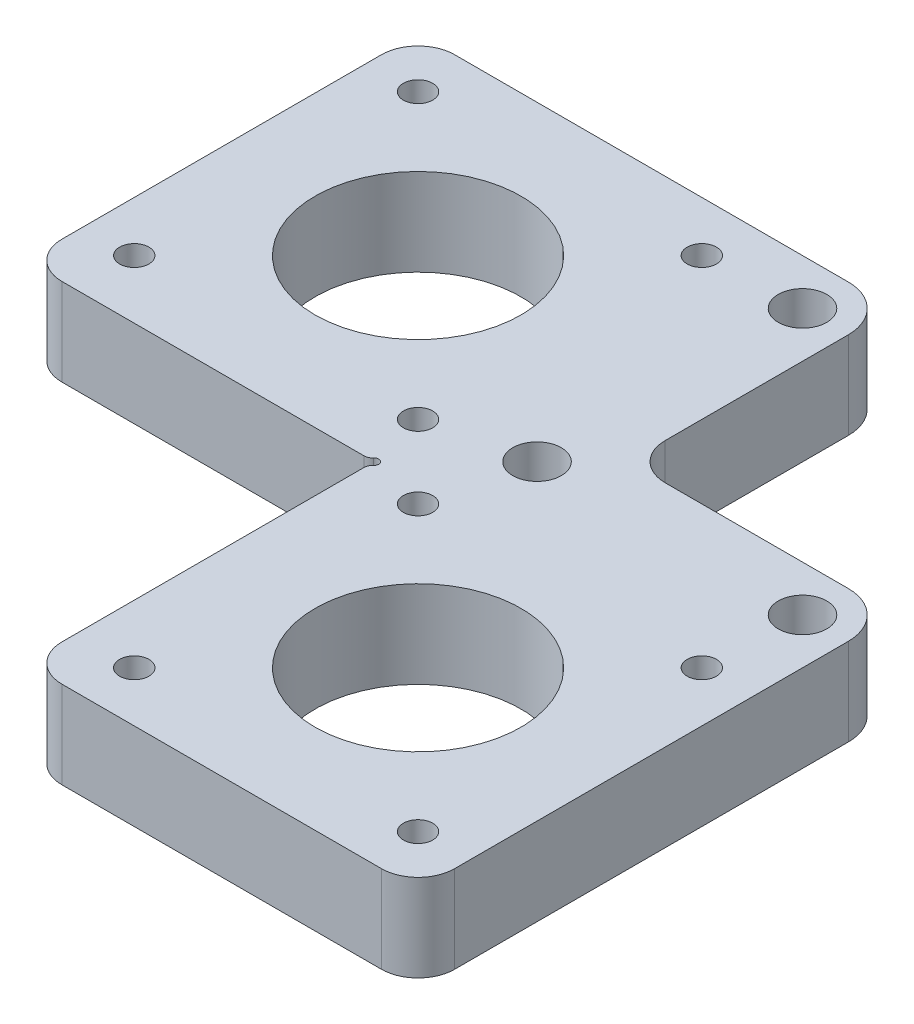
ISO-10303-21;
HEADER;
FILE_DESCRIPTION(('STEP AP214'),'2;1');
FILE_NAME('part.step','',(''),(''),'','','');
FILE_SCHEMA(('AUTOMOTIVE_DESIGN { 1 0 10303 214 1 1 1 1 }'));
ENDSEC;
DATA;
#1=APPLICATION_CONTEXT('core data for automotive mechanical design processes');
#2=APPLICATION_PROTOCOL_DEFINITION('international standard','automotive_design',2000,#1);
#3=PRODUCT_CONTEXT('',#1,'mechanical');
#4=PRODUCT('Part','Part','',(#3));
#5=PRODUCT_RELATED_PRODUCT_CATEGORY('part','',(#4));
#6=PRODUCT_DEFINITION_FORMATION('','',#4);
#7=PRODUCT_DEFINITION_CONTEXT('part definition',#1,'design');
#8=PRODUCT_DEFINITION('design','',#6,#7);
#9=PRODUCT_DEFINITION_SHAPE('','',#8);
#10=(LENGTH_UNIT() NAMED_UNIT(*) SI_UNIT(.MILLI.,.METRE.));
#11=(NAMED_UNIT(*) PLANE_ANGLE_UNIT() SI_UNIT($,.RADIAN.));
#12=(NAMED_UNIT(*) SI_UNIT($,.STERADIAN.) SOLID_ANGLE_UNIT());
#13=UNCERTAINTY_MEASURE_WITH_UNIT(LENGTH_MEASURE(1.E-05),#10,'distance_accuracy_value','');
#14=(GEOMETRIC_REPRESENTATION_CONTEXT(3) GLOBAL_UNCERTAINTY_ASSIGNED_CONTEXT((#13)) GLOBAL_UNIT_ASSIGNED_CONTEXT((#10,
#11,#12)) REPRESENTATION_CONTEXT('',''));
#15=CARTESIAN_POINT('',(0.,0.,0.));
#16=DIRECTION('',(0.,0.,1.));
#17=DIRECTION('',(1.,0.,0.));
#18=AXIS2_PLACEMENT_3D('',#15,#16,#17);
#19=CARTESIAN_POINT('',(0.,9.525,0.));
#20=DIRECTION('',(0.,1.,0.));
#21=DIRECTION('',(0.,0.,1.));
#22=AXIS2_PLACEMENT_3D('',#19,#20,#21);
#23=PLANE('',#22);
#24=DIRECTION('',(1.,0.,0.));
#25=VECTOR('',#24,1.);
#26=CARTESIAN_POINT('',(17.1,9.525,-17.1));
#27=LINE('',#26,#25);
#28=CARTESIAN_POINT('',(-17.,9.525,-17.1));
#29=VERTEX_POINT('',#28);
#30=CARTESIAN_POINT('',(15.9819660112501,9.525,-17.1));
#31=VERTEX_POINT('',#30);
#32=EDGE_CURVE('E281',#29,#31,#27,.T.);
#33=ORIENTED_EDGE('',*,*,#32,.T.);
#34=CARTESIAN_POINT('',(15.9819660112501,9.525,-18.1));
#35=DIRECTION('',(0.,1.,0.));
#36=DIRECTION('',(0.,0.,1.));
#37=AXIS2_PLACEMENT_3D('',#34,#35,#36);
#38=CIRCLE('',#37,1.);
#39=CARTESIAN_POINT('',(16.72732200375,9.525,-17.4333333333333));
#40=VERTEX_POINT('',#39);
#41=EDGE_CURVE('E45',#31,#40,#38,.T.);
#42=ORIENTED_EDGE('',*,*,#41,.T.);
#43=CARTESIAN_POINT('',(17.1,9.525,-17.1));
#44=DIRECTION('',(0.,1.,0.));
#45=DIRECTION('',(0.,0.,1.));
#46=AXIS2_PLACEMENT_3D('',#43,#44,#45);
#47=CIRCLE('',#46,0.499999999999999);
#48=CARTESIAN_POINT('',(17.4333333333333,9.525,-16.72732200375));
#49=VERTEX_POINT('',#48);
#50=EDGE_CURVE('E280',#49,#40,#47,.T.);
#51=ORIENTED_EDGE('',*,*,#50,.F.);
#52=CARTESIAN_POINT('',(18.1,9.525,-15.9819660112501));
#53=DIRECTION('',(0.,1.,0.));
#54=DIRECTION('',(0.,0.,1.));
#55=AXIS2_PLACEMENT_3D('',#52,#53,#54);
#56=CIRCLE('',#55,1.);
#57=CARTESIAN_POINT('',(17.1,9.525,-15.9819660112501));
#58=VERTEX_POINT('',#57);
#59=EDGE_CURVE('E52',#49,#58,#56,.T.);
#60=ORIENTED_EDGE('',*,*,#59,.T.);
#61=DIRECTION('',(0.,0.,1.));
#62=VECTOR('',#61,1.);
#63=CARTESIAN_POINT('',(17.1,9.525,-17.1));
#64=LINE('',#63,#62);
#65=CARTESIAN_POINT('',(17.1,9.525,17.));
#66=VERTEX_POINT('',#65);
#67=EDGE_CURVE('E300',#58,#66,#64,.T.);
#68=ORIENTED_EDGE('',*,*,#67,.T.);
#69=CARTESIAN_POINT('',(21.1,9.525,17.));
#70=DIRECTION('',(0.,1.,0.));
#71=DIRECTION('',(0.,0.,1.));
#72=AXIS2_PLACEMENT_3D('',#69,#70,#71);
#73=CIRCLE('',#72,4.);
#74=CARTESIAN_POINT('',(21.1,9.525,21.));
#75=VERTEX_POINT('',#74);
#76=EDGE_CURVE('E219',#66,#75,#73,.T.);
#77=ORIENTED_EDGE('',*,*,#76,.T.);
#78=DIRECTION('',(1.,0.,0.));
#79=VECTOR('',#78,1.);
#80=CARTESIAN_POINT('',(18.,9.525,21.));
#81=LINE('',#80,#79);
#82=CARTESIAN_POINT('',(56.,9.525,21.));
#83=VERTEX_POINT('',#82);
#84=EDGE_CURVE('E206',#75,#83,#81,.T.);
#85=ORIENTED_EDGE('',*,*,#84,.T.);
#86=CARTESIAN_POINT('',(56.,9.525,17.));
#87=DIRECTION('',(0.,1.,0.));
#88=DIRECTION('',(0.,0.,1.));
#89=AXIS2_PLACEMENT_3D('',#86,#87,#88);
#90=CIRCLE('',#89,4.);
#91=CARTESIAN_POINT('',(60.,9.525,17.));
#92=VERTEX_POINT('',#91);
#93=EDGE_CURVE('E221',#83,#92,#90,.T.);
#94=ORIENTED_EDGE('',*,*,#93,.T.);
#95=DIRECTION('',(0.,0.,-1.));
#96=VECTOR('',#95,1.);
#97=CARTESIAN_POINT('',(60.,9.525,21.));
#98=LINE('',#97,#96);
#99=CARTESIAN_POINT('',(60.,9.525,-26.));
#100=VERTEX_POINT('',#99);
#101=EDGE_CURVE('E183',#92,#100,#98,.T.);
#102=ORIENTED_EDGE('',*,*,#101,.T.);
#103=CARTESIAN_POINT('',(55.,9.525,-26.));
#104=DIRECTION('',(0.,1.,0.));
#105=DIRECTION('',(0.,0.,1.));
#106=AXIS2_PLACEMENT_3D('',#103,#104,#105);
#107=CIRCLE('',#106,5.);
#108=CARTESIAN_POINT('',(55.,9.525,-31.));
#109=VERTEX_POINT('',#108);
#110=EDGE_CURVE('E259',#100,#109,#107,.T.);
#111=ORIENTED_EDGE('',*,*,#110,.T.);
#112=DIRECTION('',(-1.,0.,0.));
#113=VECTOR('',#112,1.);
#114=CARTESIAN_POINT('',(60.,9.525,-31.));
#115=LINE('',#114,#113);
#116=CARTESIAN_POINT('',(35.,9.525,-31.));
#117=VERTEX_POINT('',#116);
#118=EDGE_CURVE('E384',#109,#117,#115,.T.);
#119=ORIENTED_EDGE('',*,*,#118,.T.);
#120=CARTESIAN_POINT('',(35.,9.525,-35.));
#121=DIRECTION('',(0.,1.,0.));
#122=DIRECTION('',(0.,0.,1.));
#123=AXIS2_PLACEMENT_3D('',#120,#121,#122);
#124=CIRCLE('',#123,4.);
#125=CARTESIAN_POINT('',(31.,9.525,-35.));
#126=VERTEX_POINT('',#125);
#127=EDGE_CURVE('E247',#117,#126,#124,.F.);
#128=ORIENTED_EDGE('',*,*,#127,.T.);
#129=DIRECTION('',(0.,0.,-1.));
#130=VECTOR('',#129,1.);
#131=CARTESIAN_POINT('',(31.,9.525,-31.));
#132=LINE('',#131,#130);
#133=CARTESIAN_POINT('',(31.,9.525,-55.));
#134=VERTEX_POINT('',#133);
#135=EDGE_CURVE('E386',#126,#134,#132,.T.);
#136=ORIENTED_EDGE('',*,*,#135,.T.);
#137=CARTESIAN_POINT('',(26.,9.525,-55.));
#138=DIRECTION('',(0.,1.,0.));
#139=DIRECTION('',(0.,0.,1.));
#140=AXIS2_PLACEMENT_3D('',#137,#138,#139);
#141=CIRCLE('',#140,5.);
#142=CARTESIAN_POINT('',(26.,9.525,-60.));
#143=VERTEX_POINT('',#142);
#144=EDGE_CURVE('E257',#134,#143,#141,.T.);
#145=ORIENTED_EDGE('',*,*,#144,.T.);
#146=DIRECTION('',(-1.,0.,0.));
#147=VECTOR('',#146,1.);
#148=CARTESIAN_POINT('',(31.,9.525,-60.));
#149=LINE('',#148,#147);
#150=CARTESIAN_POINT('',(-17.,9.525,-60.));
#151=VERTEX_POINT('',#150);
#152=EDGE_CURVE('E389',#143,#151,#149,.T.);
#153=ORIENTED_EDGE('',*,*,#152,.T.);
#154=CARTESIAN_POINT('',(-17.,9.525,-56.));
#155=DIRECTION('',(0.,1.,0.));
#156=DIRECTION('',(0.,0.,1.));
#157=AXIS2_PLACEMENT_3D('',#154,#155,#156);
#158=CIRCLE('',#157,4.);
#159=CARTESIAN_POINT('',(-21.,9.525,-56.));
#160=VERTEX_POINT('',#159);
#161=EDGE_CURVE('E215',#151,#160,#158,.T.);
#162=ORIENTED_EDGE('',*,*,#161,.T.);
#163=DIRECTION('',(0.,0.,1.));
#164=VECTOR('',#163,1.);
#165=CARTESIAN_POINT('',(-21.,9.525,-60.));
#166=LINE('',#165,#164);
#167=CARTESIAN_POINT('',(-21.,9.525,-21.1));
#168=VERTEX_POINT('',#167);
#169=EDGE_CURVE('E185',#160,#168,#166,.T.);
#170=ORIENTED_EDGE('',*,*,#169,.T.);
#171=CARTESIAN_POINT('',(-17.,9.525,-21.1));
#172=DIRECTION('',(0.,1.,0.));
#173=DIRECTION('',(0.,0.,1.));
#174=AXIS2_PLACEMENT_3D('',#171,#172,#173);
#175=CIRCLE('',#174,4.);
#176=EDGE_CURVE('E217',#168,#29,#175,.T.);
#177=ORIENTED_EDGE('',*,*,#176,.T.);
#178=EDGE_LOOP('',(#33,#42,#51,#60,#68,#77,#85,#94,#102,#111,#119,#128,#136,#145,#153,#162,#170,#177));
#179=FACE_BOUND('',#178,.T.);
#180=CARTESIAN_POINT('',(26.,9.525,-55.));
#181=DIRECTION('',(0.,1.,0.));
#182=DIRECTION('',(0.,0.,1.));
#183=AXIS2_PLACEMENT_3D('',#180,#181,#182);
#184=CIRCLE('',#183,2.65);
#185=CARTESIAN_POINT('',(26.,9.525,-52.35));
#186=VERTEX_POINT('',#185);
#187=EDGE_CURVE('E298',#186,#186,#184,.T.);
#188=ORIENTED_EDGE('',*,*,#187,.F.);
#189=EDGE_LOOP('',(#188));
#190=FACE_BOUND('',#189,.T.);
#191=CARTESIAN_POINT('',(26.,9.525,-26.));
#192=DIRECTION('',(0.,1.,0.));
#193=DIRECTION('',(0.,0.,1.));
#194=AXIS2_PLACEMENT_3D('',#191,#192,#193);
#195=CIRCLE('',#194,2.65);
#196=CARTESIAN_POINT('',(26.,9.525,-23.35));
#197=VERTEX_POINT('',#196);
#198=EDGE_CURVE('E310',#197,#197,#195,.T.);
#199=ORIENTED_EDGE('',*,*,#198,.F.);
#200=EDGE_LOOP('',(#199));
#201=FACE_BOUND('',#200,.T.);
#202=CARTESIAN_POINT('',(55.,9.525,-26.));
#203=DIRECTION('',(0.,1.,0.));
#204=DIRECTION('',(0.,0.,1.));
#205=AXIS2_PLACEMENT_3D('',#202,#203,#204);
#206=CIRCLE('',#205,2.65);
#207=CARTESIAN_POINT('',(55.,9.525,-23.35));
#208=VERTEX_POINT('',#207);
#209=EDGE_CURVE('E316',#208,#208,#206,.T.);
#210=ORIENTED_EDGE('',*,*,#209,.F.);
#211=EDGE_LOOP('',(#210));
#212=FACE_BOUND('',#211,.T.);
#213=CARTESIAN_POINT('',(54.5,9.525,-15.5));
#214=DIRECTION('',(0.,-1.,0.));
#215=DIRECTION('',(0.,0.,-1.));
#216=AXIS2_PLACEMENT_3D('',#213,#214,#215);
#217=CIRCLE('',#216,1.6);
#218=CARTESIAN_POINT('',(54.5,9.525,-17.1));
#219=VERTEX_POINT('',#218);
#220=EDGE_CURVE('E325',#219,#219,#217,.T.);
#221=ORIENTED_EDGE('',*,*,#220,.T.);
#222=EDGE_LOOP('',(#221));
#223=FACE_BOUND('',#222,.T.);
#224=CARTESIAN_POINT('',(23.5,9.525,-15.5));
#225=DIRECTION('',(0.,-1.,0.));
#226=DIRECTION('',(0.,0.,-1.));
#227=AXIS2_PLACEMENT_3D('',#224,#225,#226);
#228=CIRCLE('',#227,1.6);
#229=CARTESIAN_POINT('',(23.5,9.525,-17.1));
#230=VERTEX_POINT('',#229);
#231=EDGE_CURVE('E331',#230,#230,#228,.T.);
#232=ORIENTED_EDGE('',*,*,#231,.T.);
#233=EDGE_LOOP('',(#232));
#234=FACE_BOUND('',#233,.T.);
#235=CARTESIAN_POINT('',(23.5,9.525,15.5));
#236=DIRECTION('',(0.,-1.,0.));
#237=DIRECTION('',(0.,0.,-1.));
#238=AXIS2_PLACEMENT_3D('',#235,#236,#237);
#239=CIRCLE('',#238,1.6);
#240=CARTESIAN_POINT('',(23.5,9.525,13.9));
#241=VERTEX_POINT('',#240);
#242=EDGE_CURVE('E337',#241,#241,#239,.T.);
#243=ORIENTED_EDGE('',*,*,#242,.T.);
#244=EDGE_LOOP('',(#243));
#245=FACE_BOUND('',#244,.T.);
#246=CARTESIAN_POINT('',(54.5,9.525,15.5));
#247=DIRECTION('',(0.,-1.,0.));
#248=DIRECTION('',(0.,0.,-1.));
#249=AXIS2_PLACEMENT_3D('',#246,#247,#248);
#250=CIRCLE('',#249,1.6);
#251=CARTESIAN_POINT('',(54.5,9.525,13.9));
#252=VERTEX_POINT('',#251);
#253=EDGE_CURVE('E343',#252,#252,#250,.T.);
#254=ORIENTED_EDGE('',*,*,#253,.T.);
#255=EDGE_LOOP('',(#254));
#256=FACE_BOUND('',#255,.T.);
#257=CARTESIAN_POINT('',(15.5,9.525,-54.5));
#258=DIRECTION('',(0.,-1.,0.));
#259=DIRECTION('',(0.,0.,-1.));
#260=AXIS2_PLACEMENT_3D('',#257,#258,#259);
#261=CIRCLE('',#260,1.6);
#262=CARTESIAN_POINT('',(15.5,9.525,-56.1));
#263=VERTEX_POINT('',#262);
#264=EDGE_CURVE('E349',#263,#263,#261,.T.);
#265=ORIENTED_EDGE('',*,*,#264,.T.);
#266=EDGE_LOOP('',(#265));
#267=FACE_BOUND('',#266,.T.);
#268=CARTESIAN_POINT('',(15.5,9.525,-23.5));
#269=DIRECTION('',(0.,-1.,0.));
#270=DIRECTION('',(0.,0.,-1.));
#271=AXIS2_PLACEMENT_3D('',#268,#269,#270);
#272=CIRCLE('',#271,1.6);
#273=CARTESIAN_POINT('',(15.5,9.525,-25.1));
#274=VERTEX_POINT('',#273);
#275=EDGE_CURVE('E355',#274,#274,#272,.T.);
#276=ORIENTED_EDGE('',*,*,#275,.T.);
#277=EDGE_LOOP('',(#276));
#278=FACE_BOUND('',#277,.T.);
#279=CARTESIAN_POINT('',(-15.5,9.525,-23.5));
#280=DIRECTION('',(0.,-1.,0.));
#281=DIRECTION('',(0.,0.,-1.));
#282=AXIS2_PLACEMENT_3D('',#279,#280,#281);
#283=CIRCLE('',#282,1.6);
#284=CARTESIAN_POINT('',(-15.5,9.525,-25.1));
#285=VERTEX_POINT('',#284);
#286=EDGE_CURVE('E361',#285,#285,#283,.T.);
#287=ORIENTED_EDGE('',*,*,#286,.T.);
#288=EDGE_LOOP('',(#287));
#289=FACE_BOUND('',#288,.T.);
#290=CARTESIAN_POINT('',(39.,9.525,0.));
#291=DIRECTION('',(0.,1.,0.));
#292=DIRECTION('',(0.,0.,1.));
#293=AXIS2_PLACEMENT_3D('',#290,#291,#292);
#294=CIRCLE('',#293,11.25);
#295=CARTESIAN_POINT('',(39.,9.525,11.25));
#296=VERTEX_POINT('',#295);
#297=EDGE_CURVE('E376',#296,#296,#294,.T.);
#298=ORIENTED_EDGE('',*,*,#297,.F.);
#299=EDGE_LOOP('',(#298));
#300=FACE_BOUND('',#299,.T.);
#301=CARTESIAN_POINT('',(0.,9.525,-39.));
#302=DIRECTION('',(0.,1.,0.));
#303=DIRECTION('',(0.,0.,1.));
#304=AXIS2_PLACEMENT_3D('',#301,#302,#303);
#305=CIRCLE('',#304,11.25);
#306=CARTESIAN_POINT('',(0.,9.525,-27.75));
#307=VERTEX_POINT('',#306);
#308=EDGE_CURVE('E370',#307,#307,#305,.T.);
#309=ORIENTED_EDGE('',*,*,#308,.F.);
#310=EDGE_LOOP('',(#309));
#311=FACE_BOUND('',#310,.T.);
#312=CARTESIAN_POINT('',(-15.5,9.525,-54.5));
#313=DIRECTION('',(0.,-1.,0.));
#314=DIRECTION('',(0.,0.,-1.));
#315=AXIS2_PLACEMENT_3D('',#312,#313,#314);
#316=CIRCLE('',#315,1.6);
#317=CARTESIAN_POINT('',(-15.5,9.525,-56.1));
#318=VERTEX_POINT('',#317);
#319=EDGE_CURVE('E367',#318,#318,#316,.T.);
#320=ORIENTED_EDGE('',*,*,#319,.T.);
#321=EDGE_LOOP('',(#320));
#322=FACE_BOUND('',#321,.T.);
#323=ADVANCED_FACE('F37',(#179,#190,#201,#212,#223,#234,#245,#256,#267,#278,#289,#300,#311,
#322),#23,.T.);
#324=CARTESIAN_POINT('',(18.,9.525,21.));
#325=DIRECTION('',(0.,0.,-1.));
#326=DIRECTION('',(-1.,0.,0.));
#327=AXIS2_PLACEMENT_3D('',#324,#325,#326);
#328=PLANE('',#327);
#329=DIRECTION('',(1.,0.,0.));
#330=VECTOR('',#329,1.);
#331=CARTESIAN_POINT('',(18.,0.,21.));
#332=LINE('',#331,#330);
#333=CARTESIAN_POINT('',(21.1,0.,21.));
#334=VERTEX_POINT('',#333);
#335=CARTESIAN_POINT('',(56.,0.,21.));
#336=VERTEX_POINT('',#335);
#337=EDGE_CURVE('E192',#334,#336,#332,.T.);
#338=ORIENTED_EDGE('',*,*,#337,.T.);
#339=DIRECTION('',(0.,-1.,0.));
#340=VECTOR('',#339,1.);
#341=CARTESIAN_POINT('',(56.,9.525,21.));
#342=LINE('',#341,#340);
#343=EDGE_CURVE('E168',#336,#83,#342,.F.);
#344=ORIENTED_EDGE('',*,*,#343,.T.);
#345=ORIENTED_EDGE('',*,*,#84,.F.);
#346=DIRECTION('',(0.,1.,0.));
#347=VECTOR('',#346,1.);
#348=CARTESIAN_POINT('',(21.1,0.,21.));
#349=LINE('',#348,#347);
#350=EDGE_CURVE('E173',#75,#334,#349,.F.);
#351=ORIENTED_EDGE('',*,*,#350,.T.);
#352=EDGE_LOOP('',(#338,#344,#345,#351));
#353=FACE_BOUND('',#352,.T.);
#354=ADVANCED_FACE('F416',(#353),#328,.F.);
#355=CARTESIAN_POINT('',(60.,9.525,21.));
#356=DIRECTION('',(-1.,0.,0.));
#357=DIRECTION('',(0.,0.,1.));
#358=AXIS2_PLACEMENT_3D('',#355,#356,#357);
#359=PLANE('',#358);
#360=DIRECTION('',(0.,0.,-1.));
#361=VECTOR('',#360,1.);
#362=CARTESIAN_POINT('',(60.,0.,21.));
#363=LINE('',#362,#361);
#364=CARTESIAN_POINT('',(60.,0.,17.));
#365=VERTEX_POINT('',#364);
#366=CARTESIAN_POINT('',(60.,0.,-26.));
#367=VERTEX_POINT('',#366);
#368=EDGE_CURVE('E180',#365,#367,#363,.T.);
#369=ORIENTED_EDGE('',*,*,#368,.T.);
#370=DIRECTION('',(0.,-1.,0.));
#371=VECTOR('',#370,1.);
#372=CARTESIAN_POINT('',(60.,9.525,-26.));
#373=LINE('',#372,#371);
#374=EDGE_CURVE('E255',#367,#100,#373,.F.);
#375=ORIENTED_EDGE('',*,*,#374,.T.);
#376=ORIENTED_EDGE('',*,*,#101,.F.);
#377=DIRECTION('',(0.,-1.,0.));
#378=VECTOR('',#377,1.);
#379=CARTESIAN_POINT('',(60.,9.525,17.));
#380=LINE('',#379,#378);
#381=EDGE_CURVE('E167',#92,#365,#380,.T.);
#382=ORIENTED_EDGE('',*,*,#381,.T.);
#383=EDGE_LOOP('',(#369,#375,#376,#382));
#384=FACE_BOUND('',#383,.T.);
#385=ADVANCED_FACE('F179',(#384),#359,.F.);
#386=CARTESIAN_POINT('',(60.,9.525,-31.));
#387=DIRECTION('',(0.,0.,1.));
#388=DIRECTION('',(1.,0.,0.));
#389=AXIS2_PLACEMENT_3D('',#386,#387,#388);
#390=PLANE('',#389);
#391=ORIENTED_EDGE('',*,*,#118,.F.);
#392=DIRECTION('',(0.,-1.,0.));
#393=VECTOR('',#392,1.);
#394=CARTESIAN_POINT('',(55.,9.525,-31.));
#395=LINE('',#394,#393);
#396=CARTESIAN_POINT('',(55.,0.,-31.));
#397=VERTEX_POINT('',#396);
#398=EDGE_CURVE('E249',#109,#397,#395,.T.);
#399=ORIENTED_EDGE('',*,*,#398,.T.);
#400=DIRECTION('',(-1.,0.,0.));
#401=VECTOR('',#400,1.);
#402=CARTESIAN_POINT('',(60.,0.,-31.));
#403=LINE('',#402,#401);
#404=CARTESIAN_POINT('',(35.,0.,-31.));
#405=VERTEX_POINT('',#404);
#406=EDGE_CURVE('E191',#397,#405,#403,.T.);
#407=ORIENTED_EDGE('',*,*,#406,.T.);
#408=DIRECTION('',(0.,-1.,0.));
#409=VECTOR('',#408,1.);
#410=CARTESIAN_POINT('',(35.,9.525,-31.));
#411=LINE('',#410,#409);
#412=EDGE_CURVE('E241',#405,#117,#411,.F.);
#413=ORIENTED_EDGE('',*,*,#412,.T.);
#414=EDGE_LOOP('',(#391,#399,#407,#413));
#415=FACE_BOUND('',#414,.T.);
#416=ADVANCED_FACE('F439',(#415),#390,.F.);
#417=CARTESIAN_POINT('',(31.,9.525,-31.));
#418=DIRECTION('',(-1.,0.,0.));
#419=DIRECTION('',(0.,0.,1.));
#420=AXIS2_PLACEMENT_3D('',#417,#418,#419);
#421=PLANE('',#420);
#422=DIRECTION('',(0.,0.,-1.));
#423=VECTOR('',#422,1.);
#424=CARTESIAN_POINT('',(31.,0.,-31.));
#425=LINE('',#424,#423);
#426=CARTESIAN_POINT('',(31.,0.,-35.));
#427=VERTEX_POINT('',#426);
#428=CARTESIAN_POINT('',(31.,0.,-55.));
#429=VERTEX_POINT('',#428);
#430=EDGE_CURVE('E194',#427,#429,#425,.T.);
#431=ORIENTED_EDGE('',*,*,#430,.T.);
#432=DIRECTION('',(0.,-1.,0.));
#433=VECTOR('',#432,1.);
#434=CARTESIAN_POINT('',(31.,9.525,-55.));
#435=LINE('',#434,#433);
#436=EDGE_CURVE('E264',#429,#134,#435,.F.);
#437=ORIENTED_EDGE('',*,*,#436,.T.);
#438=ORIENTED_EDGE('',*,*,#135,.F.);
#439=DIRECTION('',(0.,-1.,0.));
#440=VECTOR('',#439,1.);
#441=CARTESIAN_POINT('',(31.,0.,-35.));
#442=LINE('',#441,#440);
#443=EDGE_CURVE('E238',#126,#427,#442,.T.);
#444=ORIENTED_EDGE('',*,*,#443,.T.);
#445=EDGE_LOOP('',(#431,#437,#438,#444));
#446=FACE_BOUND('',#445,.T.);
#447=ADVANCED_FACE('F435',(#446),#421,.F.);
#448=CARTESIAN_POINT('',(31.,9.525,-60.));
#449=DIRECTION('',(0.,0.,1.));
#450=DIRECTION('',(1.,0.,0.));
#451=AXIS2_PLACEMENT_3D('',#448,#449,#450);
#452=PLANE('',#451);
#453=ORIENTED_EDGE('',*,*,#152,.F.);
#454=DIRECTION('',(0.,-1.,0.));
#455=VECTOR('',#454,1.);
#456=CARTESIAN_POINT('',(26.,9.525,-60.));
#457=LINE('',#456,#455);
#458=CARTESIAN_POINT('',(26.,0.,-60.));
#459=VERTEX_POINT('',#458);
#460=EDGE_CURVE('E261',#143,#459,#457,.T.);
#461=ORIENTED_EDGE('',*,*,#460,.T.);
#462=DIRECTION('',(-1.,0.,0.));
#463=VECTOR('',#462,1.);
#464=CARTESIAN_POINT('',(31.,0.,-60.));
#465=LINE('',#464,#463);
#466=CARTESIAN_POINT('',(-17.,0.,-60.));
#467=VERTEX_POINT('',#466);
#468=EDGE_CURVE('E202',#459,#467,#465,.T.);
#469=ORIENTED_EDGE('',*,*,#468,.T.);
#470=DIRECTION('',(0.,-1.,0.));
#471=VECTOR('',#470,1.);
#472=CARTESIAN_POINT('',(-17.,9.525,-60.));
#473=LINE('',#472,#471);
#474=EDGE_CURVE('E235',#467,#151,#473,.F.);
#475=ORIENTED_EDGE('',*,*,#474,.T.);
#476=EDGE_LOOP('',(#453,#461,#469,#475));
#477=FACE_BOUND('',#476,.T.);
#478=ADVANCED_FACE('F432',(#477),#452,.F.);
#479=CARTESIAN_POINT('',(-21.,9.525,-60.));
#480=DIRECTION('',(1.,0.,0.));
#481=DIRECTION('',(0.,0.,-1.));
#482=AXIS2_PLACEMENT_3D('',#479,#480,#481);
#483=PLANE('',#482);
#484=DIRECTION('',(0.,0.,1.));
#485=VECTOR('',#484,1.);
#486=CARTESIAN_POINT('',(-21.,0.,-60.));
#487=LINE('',#486,#485);
#488=CARTESIAN_POINT('',(-21.,0.,-56.));
#489=VERTEX_POINT('',#488);
#490=CARTESIAN_POINT('',(-21.,0.,-21.1));
#491=VERTEX_POINT('',#490);
#492=EDGE_CURVE('E204',#489,#491,#487,.T.);
#493=ORIENTED_EDGE('',*,*,#492,.T.);
#494=DIRECTION('',(0.,1.,0.));
#495=VECTOR('',#494,1.);
#496=CARTESIAN_POINT('',(-21.,9.525,-21.1));
#497=LINE('',#496,#495);
#498=EDGE_CURVE('E229',#491,#168,#497,.T.);
#499=ORIENTED_EDGE('',*,*,#498,.T.);
#500=ORIENTED_EDGE('',*,*,#169,.F.);
#501=DIRECTION('',(0.,-1.,0.));
#502=VECTOR('',#501,1.);
#503=CARTESIAN_POINT('',(-21.,9.525,-56.));
#504=LINE('',#503,#502);
#505=EDGE_CURVE('E226',#160,#489,#504,.T.);
#506=ORIENTED_EDGE('',*,*,#505,.T.);
#507=EDGE_LOOP('',(#493,#499,#500,#506));
#508=FACE_BOUND('',#507,.T.);
#509=ADVANCED_FACE('F395',(#508),#483,.F.);
#510=CARTESIAN_POINT('',(0.,0.,0.));
#511=DIRECTION('',(0.,1.,0.));
#512=DIRECTION('',(0.,0.,1.));
#513=AXIS2_PLACEMENT_3D('',#510,#511,#512);
#514=PLANE('',#513);
#515=CARTESIAN_POINT('',(26.,0.,-55.));
#516=DIRECTION('',(0.,1.,0.));
#517=DIRECTION('',(0.,0.,1.));
#518=AXIS2_PLACEMENT_3D('',#515,#516,#517);
#519=CIRCLE('',#518,2.65);
#520=CARTESIAN_POINT('',(26.,0.,-52.35));
#521=VERTEX_POINT('',#520);
#522=EDGE_CURVE('E307',#521,#521,#519,.T.);
#523=ORIENTED_EDGE('',*,*,#522,.T.);
#524=EDGE_LOOP('',(#523));
#525=FACE_BOUND('',#524,.T.);
#526=CARTESIAN_POINT('',(26.,0.,-26.));
#527=DIRECTION('',(0.,1.,0.));
#528=DIRECTION('',(0.,0.,1.));
#529=AXIS2_PLACEMENT_3D('',#526,#527,#528);
#530=CIRCLE('',#529,2.65);
#531=CARTESIAN_POINT('',(26.,0.,-23.35));
#532=VERTEX_POINT('',#531);
#533=EDGE_CURVE('E313',#532,#532,#530,.T.);
#534=ORIENTED_EDGE('',*,*,#533,.T.);
#535=EDGE_LOOP('',(#534));
#536=FACE_BOUND('',#535,.T.);
#537=CARTESIAN_POINT('',(55.,0.,-26.));
#538=DIRECTION('',(0.,1.,0.));
#539=DIRECTION('',(0.,0.,1.));
#540=AXIS2_PLACEMENT_3D('',#537,#538,#539);
#541=CIRCLE('',#540,2.65);
#542=CARTESIAN_POINT('',(55.,0.,-23.35));
#543=VERTEX_POINT('',#542);
#544=EDGE_CURVE('E319',#543,#543,#541,.T.);
#545=ORIENTED_EDGE('',*,*,#544,.T.);
#546=EDGE_LOOP('',(#545));
#547=FACE_BOUND('',#546,.T.);
#548=CARTESIAN_POINT('',(54.5,0.,-15.5));
#549=DIRECTION('',(0.,-1.,0.));
#550=DIRECTION('',(0.,0.,-1.));
#551=AXIS2_PLACEMENT_3D('',#548,#549,#550);
#552=CIRCLE('',#551,1.6);
#553=CARTESIAN_POINT('',(54.5,0.,-17.1));
#554=VERTEX_POINT('',#553);
#555=EDGE_CURVE('E322',#554,#554,#552,.T.);
#556=ORIENTED_EDGE('',*,*,#555,.F.);
#557=EDGE_LOOP('',(#556));
#558=FACE_BOUND('',#557,.T.);
#559=CARTESIAN_POINT('',(23.5,0.,-15.5));
#560=DIRECTION('',(0.,-1.,0.));
#561=DIRECTION('',(0.,0.,-1.));
#562=AXIS2_PLACEMENT_3D('',#559,#560,#561);
#563=CIRCLE('',#562,1.6);
#564=CARTESIAN_POINT('',(23.5,0.,-17.1));
#565=VERTEX_POINT('',#564);
#566=EDGE_CURVE('E328',#565,#565,#563,.T.);
#567=ORIENTED_EDGE('',*,*,#566,.F.);
#568=EDGE_LOOP('',(#567));
#569=FACE_BOUND('',#568,.T.);
#570=CARTESIAN_POINT('',(23.5,0.,15.5));
#571=DIRECTION('',(0.,-1.,0.));
#572=DIRECTION('',(0.,0.,-1.));
#573=AXIS2_PLACEMENT_3D('',#570,#571,#572);
#574=CIRCLE('',#573,1.6);
#575=CARTESIAN_POINT('',(23.5,0.,13.9));
#576=VERTEX_POINT('',#575);
#577=EDGE_CURVE('E334',#576,#576,#574,.T.);
#578=ORIENTED_EDGE('',*,*,#577,.F.);
#579=EDGE_LOOP('',(#578));
#580=FACE_BOUND('',#579,.T.);
#581=CARTESIAN_POINT('',(54.5,0.,15.5));
#582=DIRECTION('',(0.,-1.,0.));
#583=DIRECTION('',(0.,0.,-1.));
#584=AXIS2_PLACEMENT_3D('',#581,#582,#583);
#585=CIRCLE('',#584,1.6);
#586=CARTESIAN_POINT('',(54.5,0.,13.9));
#587=VERTEX_POINT('',#586);
#588=EDGE_CURVE('E340',#587,#587,#585,.T.);
#589=ORIENTED_EDGE('',*,*,#588,.F.);
#590=EDGE_LOOP('',(#589));
#591=FACE_BOUND('',#590,.T.);
#592=CARTESIAN_POINT('',(15.5,0.,-54.5));
#593=DIRECTION('',(0.,-1.,0.));
#594=DIRECTION('',(0.,0.,-1.));
#595=AXIS2_PLACEMENT_3D('',#592,#593,#594);
#596=CIRCLE('',#595,1.6);
#597=CARTESIAN_POINT('',(15.5,0.,-56.1));
#598=VERTEX_POINT('',#597);
#599=EDGE_CURVE('E346',#598,#598,#596,.T.);
#600=ORIENTED_EDGE('',*,*,#599,.F.);
#601=EDGE_LOOP('',(#600));
#602=FACE_BOUND('',#601,.T.);
#603=CARTESIAN_POINT('',(15.5,0.,-23.5));
#604=DIRECTION('',(0.,-1.,0.));
#605=DIRECTION('',(0.,0.,-1.));
#606=AXIS2_PLACEMENT_3D('',#603,#604,#605);
#607=CIRCLE('',#606,1.6);
#608=CARTESIAN_POINT('',(15.5,0.,-25.1));
#609=VERTEX_POINT('',#608);
#610=EDGE_CURVE('E352',#609,#609,#607,.T.);
#611=ORIENTED_EDGE('',*,*,#610,.F.);
#612=EDGE_LOOP('',(#611));
#613=FACE_BOUND('',#612,.T.);
#614=CARTESIAN_POINT('',(-15.5,0.,-23.5));
#615=DIRECTION('',(0.,-1.,0.));
#616=DIRECTION('',(0.,0.,-1.));
#617=AXIS2_PLACEMENT_3D('',#614,#615,#616);
#618=CIRCLE('',#617,1.6);
#619=CARTESIAN_POINT('',(-15.5,0.,-25.1));
#620=VERTEX_POINT('',#619);
#621=EDGE_CURVE('E358',#620,#620,#618,.T.);
#622=ORIENTED_EDGE('',*,*,#621,.F.);
#623=EDGE_LOOP('',(#622));
#624=FACE_BOUND('',#623,.T.);
#625=CARTESIAN_POINT('',(-15.5,0.,-54.5));
#626=DIRECTION('',(0.,-1.,0.));
#627=DIRECTION('',(0.,0.,-1.));
#628=AXIS2_PLACEMENT_3D('',#625,#626,#627);
#629=CIRCLE('',#628,1.6);
#630=CARTESIAN_POINT('',(-15.5,0.,-56.1));
#631=VERTEX_POINT('',#630);
#632=EDGE_CURVE('E364',#631,#631,#629,.T.);
#633=ORIENTED_EDGE('',*,*,#632,.F.);
#634=EDGE_LOOP('',(#633));
#635=FACE_BOUND('',#634,.T.);
#636=CARTESIAN_POINT('',(0.,0.,-39.));
#637=DIRECTION('',(0.,1.,0.));
#638=DIRECTION('',(0.,0.,1.));
#639=AXIS2_PLACEMENT_3D('',#636,#637,#638);
#640=CIRCLE('',#639,11.25);
#641=CARTESIAN_POINT('',(0.,0.,-27.75));
#642=VERTEX_POINT('',#641);
#643=EDGE_CURVE('E373',#642,#642,#640,.T.);
#644=ORIENTED_EDGE('',*,*,#643,.T.);
#645=EDGE_LOOP('',(#644));
#646=FACE_BOUND('',#645,.T.);
#647=CARTESIAN_POINT('',(39.,0.,0.));
#648=DIRECTION('',(0.,1.,0.));
#649=DIRECTION('',(0.,0.,1.));
#650=AXIS2_PLACEMENT_3D('',#647,#648,#649);
#651=CIRCLE('',#650,11.25);
#652=CARTESIAN_POINT('',(39.,0.,11.25));
#653=VERTEX_POINT('',#652);
#654=EDGE_CURVE('E196',#653,#653,#651,.T.);
#655=ORIENTED_EDGE('',*,*,#654,.T.);
#656=EDGE_LOOP('',(#655));
#657=FACE_BOUND('',#656,.T.);
#658=CARTESIAN_POINT('',(17.1,0.,-17.1));
#659=DIRECTION('',(0.,1.,0.));
#660=DIRECTION('',(0.,0.,1.));
#661=AXIS2_PLACEMENT_3D('',#658,#659,#660);
#662=CIRCLE('',#661,0.499999999999999);
#663=CARTESIAN_POINT('',(16.72732200375,0.,-17.4333333333333));
#664=VERTEX_POINT('',#663);
#665=CARTESIAN_POINT('',(17.4333333333333,0.,-16.72732200375));
#666=VERTEX_POINT('',#665);
#667=EDGE_CURVE('E288',#664,#666,#662,.F.);
#668=ORIENTED_EDGE('',*,*,#667,.F.);
#669=CARTESIAN_POINT('',(15.9819660112501,0.,-18.1));
#670=DIRECTION('',(0.,1.,0.));
#671=DIRECTION('',(0.,0.,1.));
#672=AXIS2_PLACEMENT_3D('',#669,#670,#671);
#673=CIRCLE('',#672,1.);
#674=CARTESIAN_POINT('',(15.9819660112501,0.,-17.1));
#675=VERTEX_POINT('',#674);
#676=EDGE_CURVE('E274',#664,#675,#673,.F.);
#677=ORIENTED_EDGE('',*,*,#676,.T.);
#678=DIRECTION('',(-1.,0.,0.));
#679=VECTOR('',#678,1.);
#680=CARTESIAN_POINT('',(17.1,0.,-17.1));
#681=LINE('',#680,#679);
#682=CARTESIAN_POINT('',(-17.,0.,-17.1));
#683=VERTEX_POINT('',#682);
#684=EDGE_CURVE('E291',#675,#683,#681,.T.);
#685=ORIENTED_EDGE('',*,*,#684,.T.);
#686=CARTESIAN_POINT('',(-17.,0.,-21.1));
#687=DIRECTION('',(0.,1.,0.));
#688=DIRECTION('',(0.,0.,1.));
#689=AXIS2_PLACEMENT_3D('',#686,#687,#688);
#690=CIRCLE('',#689,4.);
#691=EDGE_CURVE('E210',#683,#491,#690,.F.);
#692=ORIENTED_EDGE('',*,*,#691,.T.);
#693=ORIENTED_EDGE('',*,*,#492,.F.);
#694=CARTESIAN_POINT('',(-17.,0.,-56.));
#695=DIRECTION('',(0.,1.,0.));
#696=DIRECTION('',(0.,0.,1.));
#697=AXIS2_PLACEMENT_3D('',#694,#695,#696);
#698=CIRCLE('',#697,4.);
#699=EDGE_CURVE('E184',#489,#467,#698,.F.);
#700=ORIENTED_EDGE('',*,*,#699,.T.);
#701=ORIENTED_EDGE('',*,*,#468,.F.);
#702=CARTESIAN_POINT('',(26.,0.,-55.));
#703=DIRECTION('',(0.,1.,0.));
#704=DIRECTION('',(0.,0.,1.));
#705=AXIS2_PLACEMENT_3D('',#702,#703,#704);
#706=CIRCLE('',#705,5.);
#707=EDGE_CURVE('E252',#459,#429,#706,.F.);
#708=ORIENTED_EDGE('',*,*,#707,.T.);
#709=ORIENTED_EDGE('',*,*,#430,.F.);
#710=CARTESIAN_POINT('',(35.,0.,-35.));
#711=DIRECTION('',(0.,1.,0.));
#712=DIRECTION('',(0.,0.,1.));
#713=AXIS2_PLACEMENT_3D('',#710,#711,#712);
#714=CIRCLE('',#713,4.);
#715=EDGE_CURVE('E244',#427,#405,#714,.T.);
#716=ORIENTED_EDGE('',*,*,#715,.T.);
#717=ORIENTED_EDGE('',*,*,#406,.F.);
#718=CARTESIAN_POINT('',(55.,0.,-26.));
#719=DIRECTION('',(0.,1.,0.));
#720=DIRECTION('',(0.,0.,1.));
#721=AXIS2_PLACEMENT_3D('',#718,#719,#720);
#722=CIRCLE('',#721,5.);
#723=EDGE_CURVE('E190',#397,#367,#722,.F.);
#724=ORIENTED_EDGE('',*,*,#723,.T.);
#725=ORIENTED_EDGE('',*,*,#368,.F.);
#726=CARTESIAN_POINT('',(56.,0.,17.));
#727=DIRECTION('',(0.,1.,0.));
#728=DIRECTION('',(0.,0.,1.));
#729=AXIS2_PLACEMENT_3D('',#726,#727,#728);
#730=CIRCLE('',#729,4.);
#731=EDGE_CURVE('E163',#365,#336,#730,.F.);
#732=ORIENTED_EDGE('',*,*,#731,.T.);
#733=ORIENTED_EDGE('',*,*,#337,.F.);
#734=CARTESIAN_POINT('',(21.1,0.,17.));
#735=DIRECTION('',(0.,1.,0.));
#736=DIRECTION('',(0.,0.,1.));
#737=AXIS2_PLACEMENT_3D('',#734,#735,#736);
#738=CIRCLE('',#737,4.);
#739=CARTESIAN_POINT('',(17.1,0.,17.));
#740=VERTEX_POINT('',#739);
#741=EDGE_CURVE('E174',#334,#740,#738,.F.);
#742=ORIENTED_EDGE('',*,*,#741,.T.);
#743=DIRECTION('',(0.,0.,-1.));
#744=VECTOR('',#743,1.);
#745=CARTESIAN_POINT('',(17.1,0.,-17.1));
#746=LINE('',#745,#744);
#747=CARTESIAN_POINT('',(17.1,0.,-15.9819660112501));
#748=VERTEX_POINT('',#747);
#749=EDGE_CURVE('E295',#740,#748,#746,.T.);
#750=ORIENTED_EDGE('',*,*,#749,.T.);
#751=CARTESIAN_POINT('',(18.1,0.,-15.9819660112501));
#752=DIRECTION('',(0.,1.,0.));
#753=DIRECTION('',(0.,0.,1.));
#754=AXIS2_PLACEMENT_3D('',#751,#752,#753);
#755=CIRCLE('',#754,1.);
#756=EDGE_CURVE('E272',#748,#666,#755,.F.);
#757=ORIENTED_EDGE('',*,*,#756,.T.);
#758=EDGE_LOOP('',(#668,#677,#685,#692,#693,#700,#701,#708,#709,#716,#717,#724,#725,#732,#733,
#742,#750,#757));
#759=FACE_BOUND('',#758,.T.);
#760=ADVANCED_FACE('F188',(#525,#536,#547,#558,#569,#580,#591,#602,#613,#624,#635,#646,#657,
#759),#514,.F.);
#761=CARTESIAN_POINT('',(39.,9.525,0.));
#762=DIRECTION('',(0.,1.,0.));
#763=DIRECTION('',(0.,0.,1.));
#764=AXIS2_PLACEMENT_3D('',#761,#762,#763);
#765=CYLINDRICAL_SURFACE('',#764,11.25);
#766=ORIENTED_EDGE('',*,*,#654,.F.);
#767=EDGE_LOOP('',(#766));
#768=FACE_BOUND('',#767,.T.);
#769=ORIENTED_EDGE('',*,*,#297,.T.);
#770=EDGE_LOOP('',(#769));
#771=FACE_BOUND('',#770,.T.);
#772=ADVANCED_FACE('F425',(#768,#771),#765,.F.);
#773=CARTESIAN_POINT('',(0.,9.525,-39.));
#774=DIRECTION('',(0.,1.,0.));
#775=DIRECTION('',(0.,0.,1.));
#776=AXIS2_PLACEMENT_3D('',#773,#774,#775);
#777=CYLINDRICAL_SURFACE('',#776,11.25);
#778=ORIENTED_EDGE('',*,*,#643,.F.);
#779=EDGE_LOOP('',(#778));
#780=FACE_BOUND('',#779,.T.);
#781=ORIENTED_EDGE('',*,*,#308,.T.);
#782=EDGE_LOOP('',(#781));
#783=FACE_BOUND('',#782,.T.);
#784=ADVANCED_FACE('F502',(#780,#783),#777,.F.);
#785=CARTESIAN_POINT('',(-15.5,0.,-54.5));
#786=DIRECTION('',(0.,-1.,0.));
#787=DIRECTION('',(0.,0.,-1.));
#788=AXIS2_PLACEMENT_3D('',#785,#786,#787);
#789=CYLINDRICAL_SURFACE('',#788,1.6);
#790=ORIENTED_EDGE('',*,*,#319,.F.);
#791=EDGE_LOOP('',(#790));
#792=FACE_BOUND('',#791,.T.);
#793=ORIENTED_EDGE('',*,*,#632,.T.);
#794=EDGE_LOOP('',(#793));
#795=FACE_BOUND('',#794,.T.);
#796=ADVANCED_FACE('F499',(#792,#795),#789,.F.);
#797=CARTESIAN_POINT('',(-15.5,0.,-23.5));
#798=DIRECTION('',(0.,-1.,0.));
#799=DIRECTION('',(0.,0.,-1.));
#800=AXIS2_PLACEMENT_3D('',#797,#798,#799);
#801=CYLINDRICAL_SURFACE('',#800,1.6);
#802=ORIENTED_EDGE('',*,*,#286,.F.);
#803=EDGE_LOOP('',(#802));
#804=FACE_BOUND('',#803,.T.);
#805=ORIENTED_EDGE('',*,*,#621,.T.);
#806=EDGE_LOOP('',(#805));
#807=FACE_BOUND('',#806,.T.);
#808=ADVANCED_FACE('F495',(#804,#807),#801,.F.);
#809=CARTESIAN_POINT('',(15.5,0.,-23.5));
#810=DIRECTION('',(0.,-1.,0.));
#811=DIRECTION('',(0.,0.,-1.));
#812=AXIS2_PLACEMENT_3D('',#809,#810,#811);
#813=CYLINDRICAL_SURFACE('',#812,1.6);
#814=ORIENTED_EDGE('',*,*,#275,.F.);
#815=EDGE_LOOP('',(#814));
#816=FACE_BOUND('',#815,.T.);
#817=ORIENTED_EDGE('',*,*,#610,.T.);
#818=EDGE_LOOP('',(#817));
#819=FACE_BOUND('',#818,.T.);
#820=ADVANCED_FACE('F491',(#816,#819),#813,.F.);
#821=CARTESIAN_POINT('',(15.5,0.,-54.5));
#822=DIRECTION('',(0.,-1.,0.));
#823=DIRECTION('',(0.,0.,-1.));
#824=AXIS2_PLACEMENT_3D('',#821,#822,#823);
#825=CYLINDRICAL_SURFACE('',#824,1.6);
#826=ORIENTED_EDGE('',*,*,#264,.F.);
#827=EDGE_LOOP('',(#826));
#828=FACE_BOUND('',#827,.T.);
#829=ORIENTED_EDGE('',*,*,#599,.T.);
#830=EDGE_LOOP('',(#829));
#831=FACE_BOUND('',#830,.T.);
#832=ADVANCED_FACE('F487',(#828,#831),#825,.F.);
#833=CARTESIAN_POINT('',(54.5,0.,15.5));
#834=DIRECTION('',(0.,-1.,0.));
#835=DIRECTION('',(0.,0.,-1.));
#836=AXIS2_PLACEMENT_3D('',#833,#834,#835);
#837=CYLINDRICAL_SURFACE('',#836,1.6);
#838=ORIENTED_EDGE('',*,*,#253,.F.);
#839=EDGE_LOOP('',(#838));
#840=FACE_BOUND('',#839,.T.);
#841=ORIENTED_EDGE('',*,*,#588,.T.);
#842=EDGE_LOOP('',(#841));
#843=FACE_BOUND('',#842,.T.);
#844=ADVANCED_FACE('F483',(#840,#843),#837,.F.);
#845=CARTESIAN_POINT('',(23.5,0.,15.5));
#846=DIRECTION('',(0.,-1.,0.));
#847=DIRECTION('',(0.,0.,-1.));
#848=AXIS2_PLACEMENT_3D('',#845,#846,#847);
#849=CYLINDRICAL_SURFACE('',#848,1.6);
#850=ORIENTED_EDGE('',*,*,#242,.F.);
#851=EDGE_LOOP('',(#850));
#852=FACE_BOUND('',#851,.T.);
#853=ORIENTED_EDGE('',*,*,#577,.T.);
#854=EDGE_LOOP('',(#853));
#855=FACE_BOUND('',#854,.T.);
#856=ADVANCED_FACE('F479',(#852,#855),#849,.F.);
#857=CARTESIAN_POINT('',(23.5,0.,-15.5));
#858=DIRECTION('',(0.,-1.,0.));
#859=DIRECTION('',(0.,0.,-1.));
#860=AXIS2_PLACEMENT_3D('',#857,#858,#859);
#861=CYLINDRICAL_SURFACE('',#860,1.6);
#862=ORIENTED_EDGE('',*,*,#231,.F.);
#863=EDGE_LOOP('',(#862));
#864=FACE_BOUND('',#863,.T.);
#865=ORIENTED_EDGE('',*,*,#566,.T.);
#866=EDGE_LOOP('',(#865));
#867=FACE_BOUND('',#866,.T.);
#868=ADVANCED_FACE('F475',(#864,#867),#861,.F.);
#869=CARTESIAN_POINT('',(54.5,0.,-15.5));
#870=DIRECTION('',(0.,-1.,0.));
#871=DIRECTION('',(0.,0.,-1.));
#872=AXIS2_PLACEMENT_3D('',#869,#870,#871);
#873=CYLINDRICAL_SURFACE('',#872,1.6);
#874=ORIENTED_EDGE('',*,*,#220,.F.);
#875=EDGE_LOOP('',(#874));
#876=FACE_BOUND('',#875,.T.);
#877=ORIENTED_EDGE('',*,*,#555,.T.);
#878=EDGE_LOOP('',(#877));
#879=FACE_BOUND('',#878,.T.);
#880=ADVANCED_FACE('F471',(#876,#879),#873,.F.);
#881=CARTESIAN_POINT('',(55.,9.525,-26.));
#882=DIRECTION('',(0.,1.,0.));
#883=DIRECTION('',(0.,0.,1.));
#884=AXIS2_PLACEMENT_3D('',#881,#882,#883);
#885=CYLINDRICAL_SURFACE('',#884,2.65);
#886=ORIENTED_EDGE('',*,*,#544,.F.);
#887=EDGE_LOOP('',(#886));
#888=FACE_BOUND('',#887,.T.);
#889=ORIENTED_EDGE('',*,*,#209,.T.);
#890=EDGE_LOOP('',(#889));
#891=FACE_BOUND('',#890,.T.);
#892=ADVANCED_FACE('F467',(#888,#891),#885,.F.);
#893=CARTESIAN_POINT('',(26.,9.525,-26.));
#894=DIRECTION('',(0.,1.,0.));
#895=DIRECTION('',(0.,0.,1.));
#896=AXIS2_PLACEMENT_3D('',#893,#894,#895);
#897=CYLINDRICAL_SURFACE('',#896,2.65);
#898=ORIENTED_EDGE('',*,*,#533,.F.);
#899=EDGE_LOOP('',(#898));
#900=FACE_BOUND('',#899,.T.);
#901=ORIENTED_EDGE('',*,*,#198,.T.);
#902=EDGE_LOOP('',(#901));
#903=FACE_BOUND('',#902,.T.);
#904=ADVANCED_FACE('F463',(#900,#903),#897,.F.);
#905=CARTESIAN_POINT('',(26.,9.525,-55.));
#906=DIRECTION('',(0.,1.,0.));
#907=DIRECTION('',(0.,0.,1.));
#908=AXIS2_PLACEMENT_3D('',#905,#906,#907);
#909=CYLINDRICAL_SURFACE('',#908,2.65);
#910=ORIENTED_EDGE('',*,*,#522,.F.);
#911=EDGE_LOOP('',(#910));
#912=FACE_BOUND('',#911,.T.);
#913=ORIENTED_EDGE('',*,*,#187,.T.);
#914=EDGE_LOOP('',(#913));
#915=FACE_BOUND('',#914,.T.);
#916=ADVANCED_FACE('F459',(#912,#915),#909,.F.);
#917=CARTESIAN_POINT('',(17.1,-55.1543289325507,-17.1));
#918=DIRECTION('',(-1.,0.,0.));
#919=DIRECTION('',(0.,0.,1.));
#920=AXIS2_PLACEMENT_3D('',#917,#918,#919);
#921=PLANE('',#920);
#922=ORIENTED_EDGE('',*,*,#67,.F.);
#923=DIRECTION('',(0.,-1.,0.));
#924=VECTOR('',#923,1.);
#925=CARTESIAN_POINT('',(17.1,0.,-15.9819660112501));
#926=LINE('',#925,#924);
#927=EDGE_CURVE('E11',#58,#748,#926,.T.);
#928=ORIENTED_EDGE('',*,*,#927,.T.);
#929=ORIENTED_EDGE('',*,*,#749,.F.);
#930=DIRECTION('',(0.,1.,0.));
#931=VECTOR('',#930,1.);
#932=CARTESIAN_POINT('',(17.1,9.525,17.));
#933=LINE('',#932,#931);
#934=EDGE_CURVE('E223',#740,#66,#933,.T.);
#935=ORIENTED_EDGE('',*,*,#934,.T.);
#936=EDGE_LOOP('',(#922,#928,#929,#935));
#937=FACE_BOUND('',#936,.T.);
#938=ADVANCED_FACE('F454',(#937),#921,.T.);
#939=CARTESIAN_POINT('',(17.1,-55.1543289325507,-17.1));
#940=DIRECTION('',(0.,0.,1.));
#941=DIRECTION('',(1.,0.,0.));
#942=AXIS2_PLACEMENT_3D('',#939,#940,#941);
#943=PLANE('',#942);
#944=ORIENTED_EDGE('',*,*,#684,.F.);
#945=DIRECTION('',(0.,-1.,0.));
#946=VECTOR('',#945,1.);
#947=CARTESIAN_POINT('',(15.9819660112501,9.525,-17.1));
#948=LINE('',#947,#946);
#949=EDGE_CURVE('E60',#675,#31,#948,.F.);
#950=ORIENTED_EDGE('',*,*,#949,.T.);
#951=ORIENTED_EDGE('',*,*,#32,.F.);
#952=DIRECTION('',(0.,1.,0.));
#953=VECTOR('',#952,1.);
#954=CARTESIAN_POINT('',(-17.,0.,-17.1));
#955=LINE('',#954,#953);
#956=EDGE_CURVE('E232',#29,#683,#955,.F.);
#957=ORIENTED_EDGE('',*,*,#956,.T.);
#958=EDGE_LOOP('',(#944,#950,#951,#957));
#959=FACE_BOUND('',#958,.T.);
#960=ADVANCED_FACE('F292',(#959),#943,.T.);
#961=CARTESIAN_POINT('',(17.1,-1.4142135623731,-17.1));
#962=DIRECTION('',(0.,1.,0.));
#963=DIRECTION('',(0.,0.,1.));
#964=AXIS2_PLACEMENT_3D('',#961,#962,#963);
#965=CYLINDRICAL_SURFACE('',#964,0.499999999999999);
#966=ORIENTED_EDGE('',*,*,#50,.T.);
#967=DIRECTION('',(0.,1.,0.));
#968=VECTOR('',#967,1.);
#969=CARTESIAN_POINT('',(16.72732200375,-1.4142135623731,-17.4333333333333));
#970=LINE('',#969,#968);
#971=EDGE_CURVE('E269',#40,#664,#970,.F.);
#972=ORIENTED_EDGE('',*,*,#971,.T.);
#973=ORIENTED_EDGE('',*,*,#667,.T.);
#974=DIRECTION('',(0.,1.,0.));
#975=VECTOR('',#974,1.);
#976=CARTESIAN_POINT('',(17.4333333333333,-1.4142135623731,-16.72732200375));
#977=LINE('',#976,#975);
#978=EDGE_CURVE('E266',#666,#49,#977,.T.);
#979=ORIENTED_EDGE('',*,*,#978,.T.);
#980=EDGE_LOOP('',(#966,#972,#973,#979));
#981=FACE_BOUND('',#980,.T.);
#982=ADVANCED_FACE('F285',(#981),#965,.F.);
#983=CARTESIAN_POINT('',(56.,9.525,17.));
#984=DIRECTION('',(0.,-1.,0.));
#985=DIRECTION('',(0.,0.,-1.));
#986=AXIS2_PLACEMENT_3D('',#983,#984,#985);
#987=CYLINDRICAL_SURFACE('',#986,4.);
#988=ORIENTED_EDGE('',*,*,#93,.F.);
#989=ORIENTED_EDGE('',*,*,#343,.F.);
#990=ORIENTED_EDGE('',*,*,#731,.F.);
#991=ORIENTED_EDGE('',*,*,#381,.F.);
#992=EDGE_LOOP('',(#988,#989,#990,#991));
#993=FACE_BOUND('',#992,.T.);
#994=ADVANCED_FACE('F166',(#993),#987,.T.);
#995=CARTESIAN_POINT('',(21.1,-55.1543289325507,17.));
#996=DIRECTION('',(0.,-1.,0.));
#997=DIRECTION('',(0.,0.,-1.));
#998=AXIS2_PLACEMENT_3D('',#995,#996,#997);
#999=CYLINDRICAL_SURFACE('',#998,4.);
#1000=ORIENTED_EDGE('',*,*,#741,.F.);
#1001=ORIENTED_EDGE('',*,*,#350,.F.);
#1002=ORIENTED_EDGE('',*,*,#76,.F.);
#1003=ORIENTED_EDGE('',*,*,#934,.F.);
#1004=EDGE_LOOP('',(#1000,#1001,#1002,#1003));
#1005=FACE_BOUND('',#1004,.T.);
#1006=ADVANCED_FACE('F405',(#1005),#999,.T.);
#1007=CARTESIAN_POINT('',(-17.,9.525,-21.1));
#1008=DIRECTION('',(0.,-1.,0.));
#1009=DIRECTION('',(0.,0.,-1.));
#1010=AXIS2_PLACEMENT_3D('',#1007,#1008,#1009);
#1011=CYLINDRICAL_SURFACE('',#1010,4.);
#1012=ORIENTED_EDGE('',*,*,#691,.F.);
#1013=ORIENTED_EDGE('',*,*,#956,.F.);
#1014=ORIENTED_EDGE('',*,*,#176,.F.);
#1015=ORIENTED_EDGE('',*,*,#498,.F.);
#1016=EDGE_LOOP('',(#1012,#1013,#1014,#1015));
#1017=FACE_BOUND('',#1016,.T.);
#1018=ADVANCED_FACE('F403',(#1017),#1011,.T.);
#1019=CARTESIAN_POINT('',(-17.,9.525,-56.));
#1020=DIRECTION('',(0.,-1.,0.));
#1021=DIRECTION('',(0.,0.,-1.));
#1022=AXIS2_PLACEMENT_3D('',#1019,#1020,#1021);
#1023=CYLINDRICAL_SURFACE('',#1022,4.);
#1024=ORIENTED_EDGE('',*,*,#161,.F.);
#1025=ORIENTED_EDGE('',*,*,#474,.F.);
#1026=ORIENTED_EDGE('',*,*,#699,.F.);
#1027=ORIENTED_EDGE('',*,*,#505,.F.);
#1028=EDGE_LOOP('',(#1024,#1025,#1026,#1027));
#1029=FACE_BOUND('',#1028,.T.);
#1030=ADVANCED_FACE('F399',(#1029),#1023,.T.);
#1031=CARTESIAN_POINT('',(35.,9.525,-35.));
#1032=DIRECTION('',(0.,1.,0.));
#1033=DIRECTION('',(0.,0.,1.));
#1034=AXIS2_PLACEMENT_3D('',#1031,#1032,#1033);
#1035=CYLINDRICAL_SURFACE('',#1034,4.);
#1036=ORIENTED_EDGE('',*,*,#127,.F.);
#1037=ORIENTED_EDGE('',*,*,#412,.F.);
#1038=ORIENTED_EDGE('',*,*,#715,.F.);
#1039=ORIENTED_EDGE('',*,*,#443,.F.);
#1040=EDGE_LOOP('',(#1036,#1037,#1038,#1039));
#1041=FACE_BOUND('',#1040,.T.);
#1042=ADVANCED_FACE('F411',(#1041),#1035,.F.);
#1043=CARTESIAN_POINT('',(55.,9.525,-26.));
#1044=DIRECTION('',(0.,-1.,0.));
#1045=DIRECTION('',(0.,0.,-1.));
#1046=AXIS2_PLACEMENT_3D('',#1043,#1044,#1045);
#1047=CYLINDRICAL_SURFACE('',#1046,5.);
#1048=ORIENTED_EDGE('',*,*,#110,.F.);
#1049=ORIENTED_EDGE('',*,*,#374,.F.);
#1050=ORIENTED_EDGE('',*,*,#723,.F.);
#1051=ORIENTED_EDGE('',*,*,#398,.F.);
#1052=EDGE_LOOP('',(#1048,#1049,#1050,#1051));
#1053=FACE_BOUND('',#1052,.T.);
#1054=ADVANCED_FACE('F712',(#1053),#1047,.T.);
#1055=CARTESIAN_POINT('',(26.,9.525,-55.));
#1056=DIRECTION('',(0.,-1.,0.));
#1057=DIRECTION('',(0.,0.,-1.));
#1058=AXIS2_PLACEMENT_3D('',#1055,#1056,#1057);
#1059=CYLINDRICAL_SURFACE('',#1058,5.);
#1060=ORIENTED_EDGE('',*,*,#144,.F.);
#1061=ORIENTED_EDGE('',*,*,#436,.F.);
#1062=ORIENTED_EDGE('',*,*,#707,.F.);
#1063=ORIENTED_EDGE('',*,*,#460,.F.);
#1064=EDGE_LOOP('',(#1060,#1061,#1062,#1063));
#1065=FACE_BOUND('',#1064,.T.);
#1066=ADVANCED_FACE('F721',(#1065),#1059,.T.);
#1067=CARTESIAN_POINT('',(15.9819660112501,-1.4142135623731,-18.1));
#1068=DIRECTION('',(0.,1.,0.));
#1069=DIRECTION('',(0.,0.,1.));
#1070=AXIS2_PLACEMENT_3D('',#1067,#1068,#1069);
#1071=CYLINDRICAL_SURFACE('',#1070,1.);
#1072=ORIENTED_EDGE('',*,*,#41,.F.);
#1073=ORIENTED_EDGE('',*,*,#949,.F.);
#1074=ORIENTED_EDGE('',*,*,#676,.F.);
#1075=ORIENTED_EDGE('',*,*,#971,.F.);
#1076=EDGE_LOOP('',(#1072,#1073,#1074,#1075));
#1077=FACE_BOUND('',#1076,.T.);
#1078=ADVANCED_FACE('F290',(#1077),#1071,.T.);
#1079=CARTESIAN_POINT('',(18.1,-1.4142135623731,-15.9819660112501));
#1080=DIRECTION('',(0.,1.,0.));
#1081=DIRECTION('',(0.,0.,1.));
#1082=AXIS2_PLACEMENT_3D('',#1079,#1080,#1081);
#1083=CYLINDRICAL_SURFACE('',#1082,1.);
#1084=ORIENTED_EDGE('',*,*,#756,.F.);
#1085=ORIENTED_EDGE('',*,*,#927,.F.);
#1086=ORIENTED_EDGE('',*,*,#59,.F.);
#1087=ORIENTED_EDGE('',*,*,#978,.F.);
#1088=EDGE_LOOP('',(#1084,#1085,#1086,#1087));
#1089=FACE_BOUND('',#1088,.T.);
#1090=ADVANCED_FACE('F39',(#1089),#1083,.T.);
#1091=CLOSED_SHELL('',(#323,#354,#385,#416,#447,#478,#509,#760,#772,#784,#796,#808,#820,#832,
#844,#856,#868,#880,#892,#904,#916,#938,#960,#982,#994,#1006,#1018,#1030,#1042,#1054,#1066,
#1078,#1090));
#1092=MANIFOLD_SOLID_BREP('B2',#1091);
#1093=ADVANCED_BREP_SHAPE_REPRESENTATION('',(#18,#1092),#14);
#1094=SHAPE_DEFINITION_REPRESENTATION(#9,#1093);
ENDSEC;
END-ISO-10303-21;
